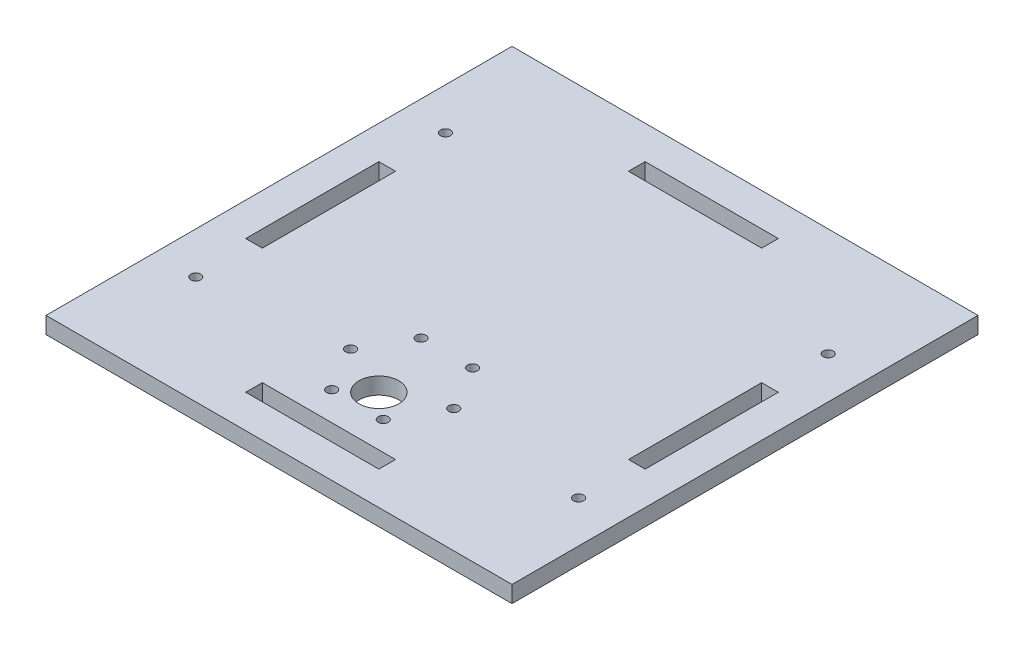
ISO-10303-21;
HEADER;
FILE_DESCRIPTION(('STEP AP214'),'2;1');
FILE_NAME('part.step','',(''),(''),'','','');
FILE_SCHEMA(('AUTOMOTIVE_DESIGN { 1 0 10303 214 1 1 1 1 }'));
ENDSEC;
DATA;
#1=APPLICATION_CONTEXT('core data for automotive mechanical design processes');
#2=APPLICATION_PROTOCOL_DEFINITION('international standard','automotive_design',2000,#1);
#3=PRODUCT_CONTEXT('',#1,'mechanical');
#4=PRODUCT('Part','Part','',(#3));
#5=PRODUCT_RELATED_PRODUCT_CATEGORY('part','',(#4));
#6=PRODUCT_DEFINITION_FORMATION('','',#4);
#7=PRODUCT_DEFINITION_CONTEXT('part definition',#1,'design');
#8=PRODUCT_DEFINITION('design','',#6,#7);
#9=PRODUCT_DEFINITION_SHAPE('','',#8);
#10=(LENGTH_UNIT() NAMED_UNIT(*) SI_UNIT(.MILLI.,.METRE.));
#11=(NAMED_UNIT(*) PLANE_ANGLE_UNIT() SI_UNIT($,.RADIAN.));
#12=(NAMED_UNIT(*) SI_UNIT($,.STERADIAN.) SOLID_ANGLE_UNIT());
#13=UNCERTAINTY_MEASURE_WITH_UNIT(LENGTH_MEASURE(1.E-05),#10,'distance_accuracy_value','');
#14=(GEOMETRIC_REPRESENTATION_CONTEXT(3) GLOBAL_UNCERTAINTY_ASSIGNED_CONTEXT((#13)) GLOBAL_UNIT_ASSIGNED_CONTEXT((#10,
#11,#12)) REPRESENTATION_CONTEXT('',''));
#15=CARTESIAN_POINT('',(0.,0.,0.));
#16=DIRECTION('',(0.,0.,1.));
#17=DIRECTION('',(1.,0.,0.));
#18=AXIS2_PLACEMENT_3D('',#15,#16,#17);
#19=CARTESIAN_POINT('',(0.,5.,0.));
#20=DIRECTION('',(0.,1.,0.));
#21=DIRECTION('',(0.,0.,1.));
#22=AXIS2_PLACEMENT_3D('',#19,#20,#21);
#23=PLANE('',#22);
#24=CARTESIAN_POINT('',(77.75,5.,-23.5766062413412));
#25=DIRECTION('',(0.,1.,0.));
#26=DIRECTION('',(0.,0.,1.));
#27=AXIS2_PLACEMENT_3D('',#24,#25,#26);
#28=CIRCLE('',#27,1.49999999999999);
#29=CARTESIAN_POINT('',(77.75,5.,-22.0766062413412));
#30=VERTEX_POINT('',#29);
#31=EDGE_CURVE('E714',#30,#30,#28,.T.);
#32=ORIENTED_EDGE('',*,*,#31,.F.);
#33=EDGE_LOOP('',(#32));
#34=FACE_BOUND('',#33,.T.);
#35=CARTESIAN_POINT('',(62.2500000000001,5.,-50.4233937586589));
#36=DIRECTION('',(0.,1.,0.));
#37=DIRECTION('',(0.,0.,1.));
#38=AXIS2_PLACEMENT_3D('',#35,#36,#37);
#39=CIRCLE('',#38,1.5);
#40=CARTESIAN_POINT('',(62.2500000000001,5.,-48.9233937586589));
#41=VERTEX_POINT('',#40);
#42=EDGE_CURVE('E722',#41,#41,#39,.T.);
#43=ORIENTED_EDGE('',*,*,#42,.F.);
#44=EDGE_LOOP('',(#43));
#45=FACE_BOUND('',#44,.T.);
#46=CARTESIAN_POINT('',(70.,5.,-30.));
#47=DIRECTION('',(0.,1.,0.));
#48=DIRECTION('',(0.,0.,1.));
#49=AXIS2_PLACEMENT_3D('',#46,#47,#48);
#50=CIRCLE('',#49,6.);
#51=CARTESIAN_POINT('',(70.,5.,-24.));
#52=VERTEX_POINT('',#51);
#53=EDGE_CURVE('E730',#52,#52,#50,.T.);
#54=ORIENTED_EDGE('',*,*,#53,.F.);
#55=EDGE_LOOP('',(#54));
#56=FACE_BOUND('',#55,.T.);
#57=DIRECTION('',(-1.,0.,0.));
#58=VECTOR('',#57,1.);
#59=CARTESIAN_POINT('',(130.,5.,-90.));
#60=LINE('',#59,#58);
#61=CARTESIAN_POINT('',(130.,5.,-90.));
#62=VERTEX_POINT('',#61);
#63=CARTESIAN_POINT('',(125.,5.,-90.));
#64=VERTEX_POINT('',#63);
#65=EDGE_CURVE('E442',#62,#64,#60,.T.);
#66=ORIENTED_EDGE('',*,*,#65,.F.);
#67=DIRECTION('',(0.,0.,-1.));
#68=VECTOR('',#67,1.);
#69=CARTESIAN_POINT('',(130.,5.,-50.));
#70=LINE('',#69,#68);
#71=CARTESIAN_POINT('',(130.,5.,-50.));
#72=VERTEX_POINT('',#71);
#73=EDGE_CURVE('E434',#72,#62,#70,.T.);
#74=ORIENTED_EDGE('',*,*,#73,.F.);
#75=DIRECTION('',(1.,0.,0.));
#76=VECTOR('',#75,1.);
#77=CARTESIAN_POINT('',(125.,5.,-50.));
#78=LINE('',#77,#76);
#79=CARTESIAN_POINT('',(125.,5.,-50.));
#80=VERTEX_POINT('',#79);
#81=EDGE_CURVE('E457',#80,#72,#78,.T.);
#82=ORIENTED_EDGE('',*,*,#81,.F.);
#83=DIRECTION('',(0.,0.,1.));
#84=VECTOR('',#83,1.);
#85=CARTESIAN_POINT('',(125.,5.,-90.));
#86=LINE('',#85,#84);
#87=EDGE_CURVE('E455',#64,#80,#86,.T.);
#88=ORIENTED_EDGE('',*,*,#87,.F.);
#89=EDGE_LOOP('',(#66,#74,#82,#88));
#90=FACE_BOUND('',#89,.T.);
#91=DIRECTION('',(-1.,0.,0.));
#92=VECTOR('',#91,1.);
#93=CARTESIAN_POINT('',(90.,5.,-15.));
#94=LINE('',#93,#92);
#95=CARTESIAN_POINT('',(90.,5.,-15.));
#96=VERTEX_POINT('',#95);
#97=CARTESIAN_POINT('',(50.,5.,-15.));
#98=VERTEX_POINT('',#97);
#99=EDGE_CURVE('E513',#96,#98,#94,.T.);
#100=ORIENTED_EDGE('',*,*,#99,.F.);
#101=DIRECTION('',(0.,0.,-1.));
#102=VECTOR('',#101,1.);
#103=CARTESIAN_POINT('',(90.,5.,-10.));
#104=LINE('',#103,#102);
#105=CARTESIAN_POINT('',(90.,5.,-10.));
#106=VERTEX_POINT('',#105);
#107=EDGE_CURVE('E511',#106,#96,#104,.T.);
#108=ORIENTED_EDGE('',*,*,#107,.F.);
#109=DIRECTION('',(1.,0.,0.));
#110=VECTOR('',#109,1.);
#111=CARTESIAN_POINT('',(50.,5.,-10.));
#112=LINE('',#111,#110);
#113=CARTESIAN_POINT('',(50.,5.,-10.));
#114=VERTEX_POINT('',#113);
#115=EDGE_CURVE('E519',#114,#106,#112,.T.);
#116=ORIENTED_EDGE('',*,*,#115,.F.);
#117=DIRECTION('',(0.,0.,1.));
#118=VECTOR('',#117,1.);
#119=CARTESIAN_POINT('',(50.,5.,-15.));
#120=LINE('',#119,#118);
#121=EDGE_CURVE('E516',#98,#114,#120,.T.);
#122=ORIENTED_EDGE('',*,*,#121,.F.);
#123=EDGE_LOOP('',(#100,#108,#116,#122));
#124=FACE_BOUND('',#123,.T.);
#125=CARTESIAN_POINT('',(127.5,5.,-32.5));
#126=DIRECTION('',(0.,1.,0.));
#127=DIRECTION('',(0.,0.,1.));
#128=AXIS2_PLACEMENT_3D('',#125,#126,#127);
#129=CIRCLE('',#128,1.5);
#130=CARTESIAN_POINT('',(127.5,5.,-31.));
#131=VERTEX_POINT('',#130);
#132=EDGE_CURVE('E580',#131,#131,#129,.T.);
#133=ORIENTED_EDGE('',*,*,#132,.F.);
#134=EDGE_LOOP('',(#133));
#135=FACE_BOUND('',#134,.T.);
#136=DIRECTION('',(0.,0.,1.));
#137=VECTOR('',#136,1.);
#138=CARTESIAN_POINT('',(0.,5.,-140.));
#139=LINE('',#138,#137);
#140=CARTESIAN_POINT('',(0.,5.,-140.));
#141=VERTEX_POINT('',#140);
#142=CARTESIAN_POINT('',(0.,5.,0.));
#143=VERTEX_POINT('',#142);
#144=EDGE_CURVE('E592',#141,#143,#139,.T.);
#145=ORIENTED_EDGE('',*,*,#144,.T.);
#146=DIRECTION('',(1.,0.,0.));
#147=VECTOR('',#146,1.);
#148=CARTESIAN_POINT('',(0.,5.,0.));
#149=LINE('',#148,#147);
#150=CARTESIAN_POINT('',(140.,5.,0.));
#151=VERTEX_POINT('',#150);
#152=EDGE_CURVE('E595',#143,#151,#149,.T.);
#153=ORIENTED_EDGE('',*,*,#152,.T.);
#154=DIRECTION('',(0.,0.,-1.));
#155=VECTOR('',#154,1.);
#156=CARTESIAN_POINT('',(140.,5.,0.));
#157=LINE('',#156,#155);
#158=CARTESIAN_POINT('',(140.,5.,-140.));
#159=VERTEX_POINT('',#158);
#160=EDGE_CURVE('E598',#151,#159,#157,.T.);
#161=ORIENTED_EDGE('',*,*,#160,.T.);
#162=DIRECTION('',(-1.,0.,0.));
#163=VECTOR('',#162,1.);
#164=CARTESIAN_POINT('',(140.,5.,-140.));
#165=LINE('',#164,#163);
#166=EDGE_CURVE('E600',#159,#141,#165,.T.);
#167=ORIENTED_EDGE('',*,*,#166,.T.);
#168=EDGE_LOOP('',(#145,#153,#161,#167));
#169=FACE_BOUND('',#168,.T.);
#170=CARTESIAN_POINT('',(12.5,5.,-107.5));
#171=DIRECTION('',(0.,1.,0.));
#172=DIRECTION('',(0.,0.,1.));
#173=AXIS2_PLACEMENT_3D('',#170,#171,#172);
#174=CIRCLE('',#173,1.5);
#175=CARTESIAN_POINT('',(12.5,5.,-106.));
#176=VERTEX_POINT('',#175);
#177=EDGE_CURVE('E586',#176,#176,#174,.T.);
#178=ORIENTED_EDGE('',*,*,#177,.F.);
#179=EDGE_LOOP('',(#178));
#180=FACE_BOUND('',#179,.T.);
#181=DIRECTION('',(1.,0.,0.));
#182=VECTOR('',#181,1.);
#183=CARTESIAN_POINT('',(10.,5.,-90.));
#184=LINE('',#183,#182);
#185=CARTESIAN_POINT('',(10.,5.,-90.));
#186=VERTEX_POINT('',#185);
#187=CARTESIAN_POINT('',(15.,5.,-90.));
#188=VERTEX_POINT('',#187);
#189=EDGE_CURVE('E548',#186,#188,#184,.T.);
#190=ORIENTED_EDGE('',*,*,#189,.T.);
#191=DIRECTION('',(0.,0.,1.));
#192=VECTOR('',#191,1.);
#193=CARTESIAN_POINT('',(15.,5.,-90.));
#194=LINE('',#193,#192);
#195=CARTESIAN_POINT('',(15.,5.,-50.));
#196=VERTEX_POINT('',#195);
#197=EDGE_CURVE('E551',#188,#196,#194,.T.);
#198=ORIENTED_EDGE('',*,*,#197,.T.);
#199=DIRECTION('',(-1.,0.,0.));
#200=VECTOR('',#199,1.);
#201=CARTESIAN_POINT('',(15.,5.,-50.));
#202=LINE('',#201,#200);
#203=CARTESIAN_POINT('',(10.,5.,-50.));
#204=VERTEX_POINT('',#203);
#205=EDGE_CURVE('E555',#196,#204,#202,.T.);
#206=ORIENTED_EDGE('',*,*,#205,.T.);
#207=DIRECTION('',(0.,0.,-1.));
#208=VECTOR('',#207,1.);
#209=CARTESIAN_POINT('',(10.,5.,-50.));
#210=LINE('',#209,#208);
#211=EDGE_CURVE('E558',#204,#186,#210,.T.);
#212=ORIENTED_EDGE('',*,*,#211,.T.);
#213=EDGE_LOOP('',(#190,#198,#206,#212));
#214=FACE_BOUND('',#213,.T.);
#215=CARTESIAN_POINT('',(12.5,5.,-32.5));
#216=DIRECTION('',(0.,-1.,0.));
#217=DIRECTION('',(0.,0.,-1.));
#218=AXIS2_PLACEMENT_3D('',#215,#216,#217);
#219=CIRCLE('',#218,1.5);
#220=CARTESIAN_POINT('',(12.5,5.,-34.));
#221=VERTEX_POINT('',#220);
#222=EDGE_CURVE('E542',#221,#221,#219,.T.);
#223=ORIENTED_EDGE('',*,*,#222,.T.);
#224=EDGE_LOOP('',(#223));
#225=FACE_BOUND('',#224,.T.);
#226=DIRECTION('',(0.,0.,1.));
#227=VECTOR('',#226,1.);
#228=CARTESIAN_POINT('',(90.,5.,-130.));
#229=LINE('',#228,#227);
#230=CARTESIAN_POINT('',(90.,5.,-130.));
#231=VERTEX_POINT('',#230);
#232=CARTESIAN_POINT('',(90.,5.,-125.));
#233=VERTEX_POINT('',#232);
#234=EDGE_CURVE('E479',#231,#233,#229,.T.);
#235=ORIENTED_EDGE('',*,*,#234,.T.);
#236=DIRECTION('',(-1.,0.,0.));
#237=VECTOR('',#236,1.);
#238=CARTESIAN_POINT('',(90.,5.,-125.));
#239=LINE('',#238,#237);
#240=CARTESIAN_POINT('',(50.,5.,-125.));
#241=VERTEX_POINT('',#240);
#242=EDGE_CURVE('E482',#233,#241,#239,.T.);
#243=ORIENTED_EDGE('',*,*,#242,.T.);
#244=DIRECTION('',(0.,0.,-1.));
#245=VECTOR('',#244,1.);
#246=CARTESIAN_POINT('',(50.,5.,-125.));
#247=LINE('',#246,#245);
#248=CARTESIAN_POINT('',(50.,5.,-130.));
#249=VERTEX_POINT('',#248);
#250=EDGE_CURVE('E486',#241,#249,#247,.T.);
#251=ORIENTED_EDGE('',*,*,#250,.T.);
#252=DIRECTION('',(1.,0.,0.));
#253=VECTOR('',#252,1.);
#254=CARTESIAN_POINT('',(50.,5.,-130.));
#255=LINE('',#254,#253);
#256=EDGE_CURVE('E489',#249,#231,#255,.T.);
#257=ORIENTED_EDGE('',*,*,#256,.T.);
#258=EDGE_LOOP('',(#235,#243,#251,#257));
#259=FACE_BOUND('',#258,.T.);
#260=CARTESIAN_POINT('',(127.5,5.,-107.5));
#261=DIRECTION('',(0.,-1.,0.));
#262=DIRECTION('',(0.,0.,-1.));
#263=AXIS2_PLACEMENT_3D('',#260,#261,#262);
#264=CIRCLE('',#263,1.5);
#265=CARTESIAN_POINT('',(127.5,5.,-109.));
#266=VERTEX_POINT('',#265);
#267=EDGE_CURVE('E473',#266,#266,#264,.T.);
#268=ORIENTED_EDGE('',*,*,#267,.T.);
#269=EDGE_LOOP('',(#268));
#270=FACE_BOUND('',#269,.T.);
#271=CARTESIAN_POINT('',(54.5,5.,-37.0000000000001));
#272=DIRECTION('',(0.,1.,0.));
#273=DIRECTION('',(0.,0.,1.));
#274=AXIS2_PLACEMENT_3D('',#271,#272,#273);
#275=CIRCLE('',#274,1.5);
#276=CARTESIAN_POINT('',(54.5,5.,-35.5000000000001));
#277=VERTEX_POINT('',#276);
#278=EDGE_CURVE('E463',#277,#277,#275,.T.);
#279=ORIENTED_EDGE('',*,*,#278,.F.);
#280=EDGE_LOOP('',(#279));
#281=FACE_BOUND('',#280,.T.);
#282=CARTESIAN_POINT('',(77.7500000000002,5.,-50.4233937586587));
#283=DIRECTION('',(0.,1.,0.));
#284=DIRECTION('',(0.,0.,1.));
#285=AXIS2_PLACEMENT_3D('',#282,#283,#284);
#286=CIRCLE('',#285,1.49999999999999);
#287=CARTESIAN_POINT('',(77.7500000000002,5.,-48.9233937586587));
#288=VERTEX_POINT('',#287);
#289=EDGE_CURVE('E726',#288,#288,#286,.T.);
#290=ORIENTED_EDGE('',*,*,#289,.F.);
#291=EDGE_LOOP('',(#290));
#292=FACE_BOUND('',#291,.T.);
#293=CARTESIAN_POINT('',(85.5,5.,-37.));
#294=DIRECTION('',(0.,1.,0.));
#295=DIRECTION('',(0.,0.,1.));
#296=AXIS2_PLACEMENT_3D('',#293,#294,#295);
#297=CIRCLE('',#296,1.5);
#298=CARTESIAN_POINT('',(85.5,5.,-35.5));
#299=VERTEX_POINT('',#298);
#300=EDGE_CURVE('E718',#299,#299,#297,.T.);
#301=ORIENTED_EDGE('',*,*,#300,.F.);
#302=EDGE_LOOP('',(#301));
#303=FACE_BOUND('',#302,.T.);
#304=CARTESIAN_POINT('',(62.25,5.,-23.5766062413412));
#305=DIRECTION('',(0.,1.,0.));
#306=DIRECTION('',(0.,0.,1.));
#307=AXIS2_PLACEMENT_3D('',#304,#305,#306);
#308=CIRCLE('',#307,1.5);
#309=CARTESIAN_POINT('',(62.25,5.,-22.0766062413412));
#310=VERTEX_POINT('',#309);
#311=EDGE_CURVE('E709',#310,#310,#308,.T.);
#312=ORIENTED_EDGE('',*,*,#311,.F.);
#313=EDGE_LOOP('',(#312));
#314=FACE_BOUND('',#313,.T.);
#315=ADVANCED_FACE('F297',(#34,#45,#56,#90,#124,#135,#169,#180,#214,#225,#259,#270,#281,#292,
#303,#314),#23,.T.);
#316=CARTESIAN_POINT('',(0.,0.,0.));
#317=DIRECTION('',(0.,1.,0.));
#318=DIRECTION('',(0.,0.,1.));
#319=AXIS2_PLACEMENT_3D('',#316,#317,#318);
#320=PLANE('',#319);
#321=DIRECTION('',(0.,0.,-1.));
#322=VECTOR('',#321,1.);
#323=CARTESIAN_POINT('',(90.,0.,-10.));
#324=LINE('',#323,#322);
#325=CARTESIAN_POINT('',(90.,0.,-10.));
#326=VERTEX_POINT('',#325);
#327=CARTESIAN_POINT('',(90.,0.,-15.));
#328=VERTEX_POINT('',#327);
#329=EDGE_CURVE('E504',#326,#328,#324,.T.);
#330=ORIENTED_EDGE('',*,*,#329,.T.);
#331=DIRECTION('',(-1.,0.,0.));
#332=VECTOR('',#331,1.);
#333=CARTESIAN_POINT('',(90.,0.,-15.));
#334=LINE('',#333,#332);
#335=CARTESIAN_POINT('',(50.,0.,-15.));
#336=VERTEX_POINT('',#335);
#337=EDGE_CURVE('E524',#328,#336,#334,.T.);
#338=ORIENTED_EDGE('',*,*,#337,.T.);
#339=DIRECTION('',(0.,0.,1.));
#340=VECTOR('',#339,1.);
#341=CARTESIAN_POINT('',(50.,0.,-15.));
#342=LINE('',#341,#340);
#343=CARTESIAN_POINT('',(50.,0.,-10.));
#344=VERTEX_POINT('',#343);
#345=EDGE_CURVE('E527',#336,#344,#342,.T.);
#346=ORIENTED_EDGE('',*,*,#345,.T.);
#347=DIRECTION('',(1.,0.,0.));
#348=VECTOR('',#347,1.);
#349=CARTESIAN_POINT('',(50.,0.,-10.));
#350=LINE('',#349,#348);
#351=EDGE_CURVE('E514',#344,#326,#350,.T.);
#352=ORIENTED_EDGE('',*,*,#351,.T.);
#353=EDGE_LOOP('',(#330,#338,#346,#352));
#354=FACE_BOUND('',#353,.T.);
#355=CARTESIAN_POINT('',(12.5,0.,-32.5));
#356=DIRECTION('',(0.,-1.,0.));
#357=DIRECTION('',(0.,0.,-1.));
#358=AXIS2_PLACEMENT_3D('',#355,#356,#357);
#359=CIRCLE('',#358,1.5);
#360=CARTESIAN_POINT('',(12.5,0.,-34.));
#361=VERTEX_POINT('',#360);
#362=EDGE_CURVE('E541',#361,#361,#359,.T.);
#363=ORIENTED_EDGE('',*,*,#362,.F.);
#364=EDGE_LOOP('',(#363));
#365=FACE_BOUND('',#364,.T.);
#366=DIRECTION('',(0.,0.,1.));
#367=VECTOR('',#366,1.);
#368=CARTESIAN_POINT('',(15.,0.,-90.));
#369=LINE('',#368,#367);
#370=CARTESIAN_POINT('',(15.,0.,-90.));
#371=VERTEX_POINT('',#370);
#372=CARTESIAN_POINT('',(15.,0.,-50.));
#373=VERTEX_POINT('',#372);
#374=EDGE_CURVE('E563',#371,#373,#369,.T.);
#375=ORIENTED_EDGE('',*,*,#374,.F.);
#376=DIRECTION('',(1.,0.,0.));
#377=VECTOR('',#376,1.);
#378=CARTESIAN_POINT('',(10.,0.,-90.));
#379=LINE('',#378,#377);
#380=CARTESIAN_POINT('',(10.,0.,-90.));
#381=VERTEX_POINT('',#380);
#382=EDGE_CURVE('E545',#381,#371,#379,.T.);
#383=ORIENTED_EDGE('',*,*,#382,.F.);
#384=DIRECTION('',(0.,0.,-1.));
#385=VECTOR('',#384,1.);
#386=CARTESIAN_POINT('',(10.,0.,-50.));
#387=LINE('',#386,#385);
#388=CARTESIAN_POINT('',(10.,0.,-50.));
#389=VERTEX_POINT('',#388);
#390=EDGE_CURVE('E552',#389,#381,#387,.T.);
#391=ORIENTED_EDGE('',*,*,#390,.F.);
#392=DIRECTION('',(-1.,0.,0.));
#393=VECTOR('',#392,1.);
#394=CARTESIAN_POINT('',(15.,0.,-50.));
#395=LINE('',#394,#393);
#396=EDGE_CURVE('E566',#373,#389,#395,.T.);
#397=ORIENTED_EDGE('',*,*,#396,.F.);
#398=EDGE_LOOP('',(#375,#383,#391,#397));
#399=FACE_BOUND('',#398,.T.);
#400=DIRECTION('',(0.,0.,1.));
#401=VECTOR('',#400,1.);
#402=CARTESIAN_POINT('',(0.,0.,-140.));
#403=LINE('',#402,#401);
#404=CARTESIAN_POINT('',(0.,0.,-140.));
#405=VERTEX_POINT('',#404);
#406=CARTESIAN_POINT('',(0.,0.,0.));
#407=VERTEX_POINT('',#406);
#408=EDGE_CURVE('E589',#405,#407,#403,.T.);
#409=ORIENTED_EDGE('',*,*,#408,.F.);
#410=DIRECTION('',(-1.,0.,0.));
#411=VECTOR('',#410,1.);
#412=CARTESIAN_POINT('',(140.,0.,-140.));
#413=LINE('',#412,#411);
#414=CARTESIAN_POINT('',(140.,0.,-140.));
#415=VERTEX_POINT('',#414);
#416=EDGE_CURVE('E596',#415,#405,#413,.T.);
#417=ORIENTED_EDGE('',*,*,#416,.F.);
#418=DIRECTION('',(0.,0.,-1.));
#419=VECTOR('',#418,1.);
#420=CARTESIAN_POINT('',(140.,0.,0.));
#421=LINE('',#420,#419);
#422=CARTESIAN_POINT('',(140.,0.,0.));
#423=VERTEX_POINT('',#422);
#424=EDGE_CURVE('E607',#423,#415,#421,.T.);
#425=ORIENTED_EDGE('',*,*,#424,.F.);
#426=DIRECTION('',(1.,0.,0.));
#427=VECTOR('',#426,1.);
#428=CARTESIAN_POINT('',(0.,0.,0.));
#429=LINE('',#428,#427);
#430=EDGE_CURVE('E605',#407,#423,#429,.T.);
#431=ORIENTED_EDGE('',*,*,#430,.F.);
#432=EDGE_LOOP('',(#409,#417,#425,#431));
#433=FACE_BOUND('',#432,.T.);
#434=CARTESIAN_POINT('',(12.5,0.,-107.5));
#435=DIRECTION('',(0.,1.,0.));
#436=DIRECTION('',(0.,0.,1.));
#437=AXIS2_PLACEMENT_3D('',#434,#435,#436);
#438=CIRCLE('',#437,1.5);
#439=CARTESIAN_POINT('',(12.5,0.,-106.));
#440=VERTEX_POINT('',#439);
#441=EDGE_CURVE('E583',#440,#440,#438,.T.);
#442=ORIENTED_EDGE('',*,*,#441,.T.);
#443=EDGE_LOOP('',(#442));
#444=FACE_BOUND('',#443,.T.);
#445=CARTESIAN_POINT('',(127.5,0.,-32.5));
#446=DIRECTION('',(0.,1.,0.));
#447=DIRECTION('',(0.,0.,1.));
#448=AXIS2_PLACEMENT_3D('',#445,#446,#447);
#449=CIRCLE('',#448,1.5);
#450=CARTESIAN_POINT('',(127.5,0.,-31.));
#451=VERTEX_POINT('',#450);
#452=EDGE_CURVE('E573',#451,#451,#449,.T.);
#453=ORIENTED_EDGE('',*,*,#452,.T.);
#454=EDGE_LOOP('',(#453));
#455=FACE_BOUND('',#454,.T.);
#456=DIRECTION('',(-1.,0.,0.));
#457=VECTOR('',#456,1.);
#458=CARTESIAN_POINT('',(90.,0.,-125.));
#459=LINE('',#458,#457);
#460=CARTESIAN_POINT('',(90.,0.,-125.));
#461=VERTEX_POINT('',#460);
#462=CARTESIAN_POINT('',(50.,0.,-125.));
#463=VERTEX_POINT('',#462);
#464=EDGE_CURVE('E494',#461,#463,#459,.T.);
#465=ORIENTED_EDGE('',*,*,#464,.F.);
#466=DIRECTION('',(0.,0.,1.));
#467=VECTOR('',#466,1.);
#468=CARTESIAN_POINT('',(90.,0.,-130.));
#469=LINE('',#468,#467);
#470=CARTESIAN_POINT('',(90.,0.,-130.));
#471=VERTEX_POINT('',#470);
#472=EDGE_CURVE('E476',#471,#461,#469,.T.);
#473=ORIENTED_EDGE('',*,*,#472,.F.);
#474=DIRECTION('',(1.,0.,0.));
#475=VECTOR('',#474,1.);
#476=CARTESIAN_POINT('',(50.,0.,-130.));
#477=LINE('',#476,#475);
#478=CARTESIAN_POINT('',(50.,0.,-130.));
#479=VERTEX_POINT('',#478);
#480=EDGE_CURVE('E483',#479,#471,#477,.T.);
#481=ORIENTED_EDGE('',*,*,#480,.F.);
#482=DIRECTION('',(0.,0.,-1.));
#483=VECTOR('',#482,1.);
#484=CARTESIAN_POINT('',(50.,0.,-125.));
#485=LINE('',#484,#483);
#486=EDGE_CURVE('E497',#463,#479,#485,.T.);
#487=ORIENTED_EDGE('',*,*,#486,.F.);
#488=EDGE_LOOP('',(#465,#473,#481,#487));
#489=FACE_BOUND('',#488,.T.);
#490=CARTESIAN_POINT('',(127.5,0.,-107.5));
#491=DIRECTION('',(0.,-1.,0.));
#492=DIRECTION('',(0.,0.,-1.));
#493=AXIS2_PLACEMENT_3D('',#490,#491,#492);
#494=CIRCLE('',#493,1.5);
#495=CARTESIAN_POINT('',(127.5,0.,-109.));
#496=VERTEX_POINT('',#495);
#497=EDGE_CURVE('E450',#496,#496,#494,.T.);
#498=ORIENTED_EDGE('',*,*,#497,.F.);
#499=EDGE_LOOP('',(#498));
#500=FACE_BOUND('',#499,.T.);
#501=DIRECTION('',(0.,0.,-1.));
#502=VECTOR('',#501,1.);
#503=CARTESIAN_POINT('',(130.,0.,-50.));
#504=LINE('',#503,#502);
#505=CARTESIAN_POINT('',(130.,0.,-50.));
#506=VERTEX_POINT('',#505);
#507=CARTESIAN_POINT('',(130.,0.,-90.));
#508=VERTEX_POINT('',#507);
#509=EDGE_CURVE('E320',#506,#508,#504,.T.);
#510=ORIENTED_EDGE('',*,*,#509,.T.);
#511=DIRECTION('',(-1.,0.,0.));
#512=VECTOR('',#511,1.);
#513=CARTESIAN_POINT('',(130.,0.,-90.));
#514=LINE('',#513,#512);
#515=CARTESIAN_POINT('',(125.,0.,-90.));
#516=VERTEX_POINT('',#515);
#517=EDGE_CURVE('E449',#508,#516,#514,.T.);
#518=ORIENTED_EDGE('',*,*,#517,.T.);
#519=DIRECTION('',(0.,0.,1.));
#520=VECTOR('',#519,1.);
#521=CARTESIAN_POINT('',(125.,0.,-90.));
#522=LINE('',#521,#520);
#523=CARTESIAN_POINT('',(125.,0.,-50.));
#524=VERTEX_POINT('',#523);
#525=EDGE_CURVE('E465',#516,#524,#522,.T.);
#526=ORIENTED_EDGE('',*,*,#525,.T.);
#527=DIRECTION('',(1.,0.,0.));
#528=VECTOR('',#527,1.);
#529=CARTESIAN_POINT('',(125.,0.,-50.));
#530=LINE('',#529,#528);
#531=EDGE_CURVE('E443',#524,#506,#530,.T.);
#532=ORIENTED_EDGE('',*,*,#531,.T.);
#533=EDGE_LOOP('',(#510,#518,#526,#532));
#534=FACE_BOUND('',#533,.T.);
#535=CARTESIAN_POINT('',(54.5,0.,-37.0000000000001));
#536=DIRECTION('',(0.,1.,0.));
#537=DIRECTION('',(0.,0.,1.));
#538=AXIS2_PLACEMENT_3D('',#535,#536,#537);
#539=CIRCLE('',#538,1.5);
#540=CARTESIAN_POINT('',(54.5,0.,-35.5000000000001));
#541=VERTEX_POINT('',#540);
#542=EDGE_CURVE('E684',#541,#541,#539,.T.);
#543=ORIENTED_EDGE('',*,*,#542,.T.);
#544=EDGE_LOOP('',(#543));
#545=FACE_BOUND('',#544,.T.);
#546=CARTESIAN_POINT('',(70.,0.,-30.));
#547=DIRECTION('',(0.,1.,0.));
#548=DIRECTION('',(0.,0.,1.));
#549=AXIS2_PLACEMENT_3D('',#546,#547,#548);
#550=CIRCLE('',#549,6.);
#551=CARTESIAN_POINT('',(70.,0.,-24.));
#552=VERTEX_POINT('',#551);
#553=EDGE_CURVE('E688',#552,#552,#550,.T.);
#554=ORIENTED_EDGE('',*,*,#553,.T.);
#555=EDGE_LOOP('',(#554));
#556=FACE_BOUND('',#555,.T.);
#557=CARTESIAN_POINT('',(77.7500000000002,0.,-50.4233937586587));
#558=DIRECTION('',(0.,1.,0.));
#559=DIRECTION('',(0.,0.,1.));
#560=AXIS2_PLACEMENT_3D('',#557,#558,#559);
#561=CIRCLE('',#560,1.49999999999999);
#562=CARTESIAN_POINT('',(77.7500000000002,0.,-48.9233937586587));
#563=VERTEX_POINT('',#562);
#564=EDGE_CURVE('E692',#563,#563,#561,.T.);
#565=ORIENTED_EDGE('',*,*,#564,.T.);
#566=EDGE_LOOP('',(#565));
#567=FACE_BOUND('',#566,.T.);
#568=CARTESIAN_POINT('',(62.2500000000001,0.,-50.4233937586589));
#569=DIRECTION('',(0.,1.,0.));
#570=DIRECTION('',(0.,0.,1.));
#571=AXIS2_PLACEMENT_3D('',#568,#569,#570);
#572=CIRCLE('',#571,1.5);
#573=CARTESIAN_POINT('',(62.2500000000001,0.,-48.9233937586589));
#574=VERTEX_POINT('',#573);
#575=EDGE_CURVE('E696',#574,#574,#572,.T.);
#576=ORIENTED_EDGE('',*,*,#575,.T.);
#577=EDGE_LOOP('',(#576));
#578=FACE_BOUND('',#577,.T.);
#579=CARTESIAN_POINT('',(85.5,0.,-37.));
#580=DIRECTION('',(0.,1.,0.));
#581=DIRECTION('',(0.,0.,1.));
#582=AXIS2_PLACEMENT_3D('',#579,#580,#581);
#583=CIRCLE('',#582,1.5);
#584=CARTESIAN_POINT('',(85.5,0.,-35.5));
#585=VERTEX_POINT('',#584);
#586=EDGE_CURVE('E700',#585,#585,#583,.T.);
#587=ORIENTED_EDGE('',*,*,#586,.T.);
#588=EDGE_LOOP('',(#587));
#589=FACE_BOUND('',#588,.T.);
#590=CARTESIAN_POINT('',(77.75,0.,-23.5766062413412));
#591=DIRECTION('',(0.,1.,0.));
#592=DIRECTION('',(0.,0.,1.));
#593=AXIS2_PLACEMENT_3D('',#590,#591,#592);
#594=CIRCLE('',#593,1.49999999999999);
#595=CARTESIAN_POINT('',(77.75,0.,-22.0766062413412));
#596=VERTEX_POINT('',#595);
#597=EDGE_CURVE('E704',#596,#596,#594,.T.);
#598=ORIENTED_EDGE('',*,*,#597,.T.);
#599=EDGE_LOOP('',(#598));
#600=FACE_BOUND('',#599,.T.);
#601=CARTESIAN_POINT('',(62.25,0.,-23.5766062413412));
#602=DIRECTION('',(0.,1.,0.));
#603=DIRECTION('',(0.,0.,1.));
#604=AXIS2_PLACEMENT_3D('',#601,#602,#603);
#605=CIRCLE('',#604,1.5);
#606=CARTESIAN_POINT('',(62.25,0.,-22.0766062413412));
#607=VERTEX_POINT('',#606);
#608=EDGE_CURVE('E707',#607,#607,#605,.T.);
#609=ORIENTED_EDGE('',*,*,#608,.T.);
#610=EDGE_LOOP('',(#609));
#611=FACE_BOUND('',#610,.T.);
#612=ADVANCED_FACE('F625',(#354,#365,#399,#433,#444,#455,#489,#500,#534,#545,#556,#567,#578,
#589,#600,#611),#320,.F.);
#613=CARTESIAN_POINT('',(0.,5.,-140.));
#614=DIRECTION('',(1.,0.,0.));
#615=DIRECTION('',(0.,0.,-1.));
#616=AXIS2_PLACEMENT_3D('',#613,#614,#615);
#617=PLANE('',#616);
#618=ORIENTED_EDGE('',*,*,#408,.T.);
#619=DIRECTION('',(0.,-1.,0.));
#620=VECTOR('',#619,1.);
#621=CARTESIAN_POINT('',(0.,5.,0.));
#622=LINE('',#621,#620);
#623=EDGE_CURVE('E12',#143,#407,#622,.T.);
#624=ORIENTED_EDGE('',*,*,#623,.F.);
#625=ORIENTED_EDGE('',*,*,#144,.F.);
#626=DIRECTION('',(0.,-1.,0.));
#627=VECTOR('',#626,1.);
#628=CARTESIAN_POINT('',(0.,5.,-140.));
#629=LINE('',#628,#627);
#630=EDGE_CURVE('E602',#141,#405,#629,.T.);
#631=ORIENTED_EDGE('',*,*,#630,.T.);
#632=EDGE_LOOP('',(#618,#624,#625,#631));
#633=FACE_BOUND('',#632,.T.);
#634=ADVANCED_FACE('F299',(#633),#617,.F.);
#635=CARTESIAN_POINT('',(0.,5.,0.));
#636=DIRECTION('',(0.,0.,-1.));
#637=DIRECTION('',(-1.,0.,0.));
#638=AXIS2_PLACEMENT_3D('',#635,#636,#637);
#639=PLANE('',#638);
#640=ORIENTED_EDGE('',*,*,#430,.T.);
#641=DIRECTION('',(0.,-1.,0.));
#642=VECTOR('',#641,1.);
#643=CARTESIAN_POINT('',(140.,5.,0.));
#644=LINE('',#643,#642);
#645=EDGE_CURVE('E305',#151,#423,#644,.T.);
#646=ORIENTED_EDGE('',*,*,#645,.F.);
#647=ORIENTED_EDGE('',*,*,#152,.F.);
#648=ORIENTED_EDGE('',*,*,#623,.T.);
#649=EDGE_LOOP('',(#640,#646,#647,#648));
#650=FACE_BOUND('',#649,.T.);
#651=ADVANCED_FACE('F636',(#650),#639,.F.);
#652=CARTESIAN_POINT('',(140.,5.,0.));
#653=DIRECTION('',(-1.,0.,0.));
#654=DIRECTION('',(0.,0.,1.));
#655=AXIS2_PLACEMENT_3D('',#652,#653,#654);
#656=PLANE('',#655);
#657=ORIENTED_EDGE('',*,*,#424,.T.);
#658=DIRECTION('',(0.,-1.,0.));
#659=VECTOR('',#658,1.);
#660=CARTESIAN_POINT('',(140.,5.,-140.));
#661=LINE('',#660,#659);
#662=EDGE_CURVE('E612',#159,#415,#661,.T.);
#663=ORIENTED_EDGE('',*,*,#662,.F.);
#664=ORIENTED_EDGE('',*,*,#160,.F.);
#665=ORIENTED_EDGE('',*,*,#645,.T.);
#666=EDGE_LOOP('',(#657,#663,#664,#665));
#667=FACE_BOUND('',#666,.T.);
#668=ADVANCED_FACE('F619',(#667),#656,.F.);
#669=CARTESIAN_POINT('',(140.,5.,-140.));
#670=DIRECTION('',(0.,0.,1.));
#671=DIRECTION('',(1.,0.,0.));
#672=AXIS2_PLACEMENT_3D('',#669,#670,#671);
#673=PLANE('',#672);
#674=ORIENTED_EDGE('',*,*,#416,.T.);
#675=ORIENTED_EDGE('',*,*,#630,.F.);
#676=ORIENTED_EDGE('',*,*,#166,.F.);
#677=ORIENTED_EDGE('',*,*,#662,.T.);
#678=EDGE_LOOP('',(#674,#675,#676,#677));
#679=FACE_BOUND('',#678,.T.);
#680=ADVANCED_FACE('F629',(#679),#673,.F.);
#681=CARTESIAN_POINT('',(12.5,5.,-107.5));
#682=DIRECTION('',(0.,-1.,0.));
#683=DIRECTION('',(0.,0.,-1.));
#684=AXIS2_PLACEMENT_3D('',#681,#682,#683);
#685=CYLINDRICAL_SURFACE('',#684,1.5);
#686=ORIENTED_EDGE('',*,*,#177,.T.);
#687=EDGE_LOOP('',(#686));
#688=FACE_BOUND('',#687,.T.);
#689=ORIENTED_EDGE('',*,*,#441,.F.);
#690=EDGE_LOOP('',(#689));
#691=FACE_BOUND('',#690,.T.);
#692=ADVANCED_FACE('F654',(#688,#691),#685,.F.);
#693=CARTESIAN_POINT('',(127.5,5.,-32.5));
#694=DIRECTION('',(0.,-1.,0.));
#695=DIRECTION('',(0.,0.,-1.));
#696=AXIS2_PLACEMENT_3D('',#693,#694,#695);
#697=CYLINDRICAL_SURFACE('',#696,1.5);
#698=ORIENTED_EDGE('',*,*,#132,.T.);
#699=EDGE_LOOP('',(#698));
#700=FACE_BOUND('',#699,.T.);
#701=ORIENTED_EDGE('',*,*,#452,.F.);
#702=EDGE_LOOP('',(#701));
#703=FACE_BOUND('',#702,.T.);
#704=ADVANCED_FACE('F661',(#700,#703),#697,.F.);
#705=CARTESIAN_POINT('',(10.,5.,-90.));
#706=DIRECTION('',(0.,0.,-1.));
#707=DIRECTION('',(-1.,0.,0.));
#708=AXIS2_PLACEMENT_3D('',#705,#706,#707);
#709=PLANE('',#708);
#710=ORIENTED_EDGE('',*,*,#382,.T.);
#711=DIRECTION('',(0.,-1.,0.));
#712=VECTOR('',#711,1.);
#713=CARTESIAN_POINT('',(15.,5.,-90.));
#714=LINE('',#713,#712);
#715=EDGE_CURVE('E561',#188,#371,#714,.T.);
#716=ORIENTED_EDGE('',*,*,#715,.F.);
#717=ORIENTED_EDGE('',*,*,#189,.F.);
#718=DIRECTION('',(0.,-1.,0.));
#719=VECTOR('',#718,1.);
#720=CARTESIAN_POINT('',(10.,5.,-90.));
#721=LINE('',#720,#719);
#722=EDGE_CURVE('E571',#186,#381,#721,.T.);
#723=ORIENTED_EDGE('',*,*,#722,.T.);
#724=EDGE_LOOP('',(#710,#716,#717,#723));
#725=FACE_BOUND('',#724,.T.);
#726=ADVANCED_FACE('F666',(#725),#709,.F.);
#727=CARTESIAN_POINT('',(10.,5.,-50.));
#728=DIRECTION('',(-1.,0.,0.));
#729=DIRECTION('',(0.,0.,1.));
#730=AXIS2_PLACEMENT_3D('',#727,#728,#729);
#731=PLANE('',#730);
#732=ORIENTED_EDGE('',*,*,#390,.T.);
#733=ORIENTED_EDGE('',*,*,#722,.F.);
#734=ORIENTED_EDGE('',*,*,#211,.F.);
#735=DIRECTION('',(0.,-1.,0.));
#736=VECTOR('',#735,1.);
#737=CARTESIAN_POINT('',(10.,5.,-50.));
#738=LINE('',#737,#736);
#739=EDGE_CURVE('E574',#204,#389,#738,.T.);
#740=ORIENTED_EDGE('',*,*,#739,.T.);
#741=EDGE_LOOP('',(#732,#733,#734,#740));
#742=FACE_BOUND('',#741,.T.);
#743=ADVANCED_FACE('F827',(#742),#731,.F.);
#744=CARTESIAN_POINT('',(15.,5.,-50.));
#745=DIRECTION('',(0.,0.,1.));
#746=DIRECTION('',(1.,0.,0.));
#747=AXIS2_PLACEMENT_3D('',#744,#745,#746);
#748=PLANE('',#747);
#749=ORIENTED_EDGE('',*,*,#396,.T.);
#750=ORIENTED_EDGE('',*,*,#739,.F.);
#751=ORIENTED_EDGE('',*,*,#205,.F.);
#752=DIRECTION('',(0.,-1.,0.));
#753=VECTOR('',#752,1.);
#754=CARTESIAN_POINT('',(15.,5.,-50.));
#755=LINE('',#754,#753);
#756=EDGE_CURVE('E576',#196,#373,#755,.T.);
#757=ORIENTED_EDGE('',*,*,#756,.T.);
#758=EDGE_LOOP('',(#749,#750,#751,#757));
#759=FACE_BOUND('',#758,.T.);
#760=ADVANCED_FACE('F830',(#759),#748,.F.);
#761=CARTESIAN_POINT('',(15.,5.,-90.));
#762=DIRECTION('',(1.,0.,0.));
#763=DIRECTION('',(0.,0.,-1.));
#764=AXIS2_PLACEMENT_3D('',#761,#762,#763);
#765=PLANE('',#764);
#766=ORIENTED_EDGE('',*,*,#374,.T.);
#767=ORIENTED_EDGE('',*,*,#756,.F.);
#768=ORIENTED_EDGE('',*,*,#197,.F.);
#769=ORIENTED_EDGE('',*,*,#715,.T.);
#770=EDGE_LOOP('',(#766,#767,#768,#769));
#771=FACE_BOUND('',#770,.T.);
#772=ADVANCED_FACE('F825',(#771),#765,.F.);
#773=CARTESIAN_POINT('',(12.5,5.,-32.5));
#774=DIRECTION('',(0.,-1.,0.));
#775=DIRECTION('',(0.,0.,-1.));
#776=AXIS2_PLACEMENT_3D('',#773,#774,#775);
#777=CYLINDRICAL_SURFACE('',#776,1.5);
#778=ORIENTED_EDGE('',*,*,#222,.F.);
#779=EDGE_LOOP('',(#778));
#780=FACE_BOUND('',#779,.T.);
#781=ORIENTED_EDGE('',*,*,#362,.T.);
#782=EDGE_LOOP('',(#781));
#783=FACE_BOUND('',#782,.T.);
#784=ADVANCED_FACE('F821',(#780,#783),#777,.F.);
#785=CARTESIAN_POINT('',(90.,5.,-10.));
#786=DIRECTION('',(-1.,0.,0.));
#787=DIRECTION('',(0.,0.,1.));
#788=AXIS2_PLACEMENT_3D('',#785,#786,#787);
#789=PLANE('',#788);
#790=ORIENTED_EDGE('',*,*,#329,.F.);
#791=DIRECTION('',(0.,-1.,0.));
#792=VECTOR('',#791,1.);
#793=CARTESIAN_POINT('',(90.,5.,-10.));
#794=LINE('',#793,#792);
#795=EDGE_CURVE('E521',#106,#326,#794,.T.);
#796=ORIENTED_EDGE('',*,*,#795,.F.);
#797=ORIENTED_EDGE('',*,*,#107,.T.);
#798=DIRECTION('',(0.,-1.,0.));
#799=VECTOR('',#798,1.);
#800=CARTESIAN_POINT('',(90.,5.,-15.));
#801=LINE('',#800,#799);
#802=EDGE_CURVE('E538',#96,#328,#801,.T.);
#803=ORIENTED_EDGE('',*,*,#802,.T.);
#804=EDGE_LOOP('',(#790,#796,#797,#803));
#805=FACE_BOUND('',#804,.T.);
#806=ADVANCED_FACE('F817',(#805),#789,.T.);
#807=CARTESIAN_POINT('',(90.,5.,-15.));
#808=DIRECTION('',(0.,0.,1.));
#809=DIRECTION('',(1.,0.,0.));
#810=AXIS2_PLACEMENT_3D('',#807,#808,#809);
#811=PLANE('',#810);
#812=ORIENTED_EDGE('',*,*,#337,.F.);
#813=ORIENTED_EDGE('',*,*,#802,.F.);
#814=ORIENTED_EDGE('',*,*,#99,.T.);
#815=DIRECTION('',(0.,-1.,0.));
#816=VECTOR('',#815,1.);
#817=CARTESIAN_POINT('',(50.,5.,-15.));
#818=LINE('',#817,#816);
#819=EDGE_CURVE('E536',#98,#336,#818,.T.);
#820=ORIENTED_EDGE('',*,*,#819,.T.);
#821=EDGE_LOOP('',(#812,#813,#814,#820));
#822=FACE_BOUND('',#821,.T.);
#823=ADVANCED_FACE('F813',(#822),#811,.T.);
#824=CARTESIAN_POINT('',(50.,5.,-15.));
#825=DIRECTION('',(1.,0.,0.));
#826=DIRECTION('',(0.,0.,-1.));
#827=AXIS2_PLACEMENT_3D('',#824,#825,#826);
#828=PLANE('',#827);
#829=ORIENTED_EDGE('',*,*,#345,.F.);
#830=ORIENTED_EDGE('',*,*,#819,.F.);
#831=ORIENTED_EDGE('',*,*,#121,.T.);
#832=DIRECTION('',(0.,-1.,0.));
#833=VECTOR('',#832,1.);
#834=CARTESIAN_POINT('',(50.,5.,-10.));
#835=LINE('',#834,#833);
#836=EDGE_CURVE('E534',#114,#344,#835,.T.);
#837=ORIENTED_EDGE('',*,*,#836,.T.);
#838=EDGE_LOOP('',(#829,#830,#831,#837));
#839=FACE_BOUND('',#838,.T.);
#840=ADVANCED_FACE('F809',(#839),#828,.T.);
#841=CARTESIAN_POINT('',(50.,5.,-10.));
#842=DIRECTION('',(0.,0.,-1.));
#843=DIRECTION('',(-1.,0.,0.));
#844=AXIS2_PLACEMENT_3D('',#841,#842,#843);
#845=PLANE('',#844);
#846=ORIENTED_EDGE('',*,*,#351,.F.);
#847=ORIENTED_EDGE('',*,*,#836,.F.);
#848=ORIENTED_EDGE('',*,*,#115,.T.);
#849=ORIENTED_EDGE('',*,*,#795,.T.);
#850=EDGE_LOOP('',(#846,#847,#848,#849));
#851=FACE_BOUND('',#850,.T.);
#852=ADVANCED_FACE('F805',(#851),#845,.T.);
#853=CARTESIAN_POINT('',(90.,5.,-130.));
#854=DIRECTION('',(1.,0.,0.));
#855=DIRECTION('',(0.,0.,-1.));
#856=AXIS2_PLACEMENT_3D('',#853,#854,#855);
#857=PLANE('',#856);
#858=ORIENTED_EDGE('',*,*,#472,.T.);
#859=DIRECTION('',(0.,-1.,0.));
#860=VECTOR('',#859,1.);
#861=CARTESIAN_POINT('',(90.,5.,-125.));
#862=LINE('',#861,#860);
#863=EDGE_CURVE('E492',#233,#461,#862,.T.);
#864=ORIENTED_EDGE('',*,*,#863,.F.);
#865=ORIENTED_EDGE('',*,*,#234,.F.);
#866=DIRECTION('',(0.,-1.,0.));
#867=VECTOR('',#866,1.);
#868=CARTESIAN_POINT('',(90.,5.,-130.));
#869=LINE('',#868,#867);
#870=EDGE_CURVE('E502',#231,#471,#869,.T.);
#871=ORIENTED_EDGE('',*,*,#870,.T.);
#872=EDGE_LOOP('',(#858,#864,#865,#871));
#873=FACE_BOUND('',#872,.T.);
#874=ADVANCED_FACE('F795',(#873),#857,.F.);
#875=CARTESIAN_POINT('',(50.,5.,-130.));
#876=DIRECTION('',(0.,0.,-1.));
#877=DIRECTION('',(-1.,0.,0.));
#878=AXIS2_PLACEMENT_3D('',#875,#876,#877);
#879=PLANE('',#878);
#880=ORIENTED_EDGE('',*,*,#480,.T.);
#881=ORIENTED_EDGE('',*,*,#870,.F.);
#882=ORIENTED_EDGE('',*,*,#256,.F.);
#883=DIRECTION('',(0.,-1.,0.));
#884=VECTOR('',#883,1.);
#885=CARTESIAN_POINT('',(50.,5.,-130.));
#886=LINE('',#885,#884);
#887=EDGE_CURVE('E505',#249,#479,#886,.T.);
#888=ORIENTED_EDGE('',*,*,#887,.T.);
#889=EDGE_LOOP('',(#880,#881,#882,#888));
#890=FACE_BOUND('',#889,.T.);
#891=ADVANCED_FACE('F791',(#890),#879,.F.);
#892=CARTESIAN_POINT('',(50.,5.,-125.));
#893=DIRECTION('',(-1.,0.,0.));
#894=DIRECTION('',(0.,0.,1.));
#895=AXIS2_PLACEMENT_3D('',#892,#893,#894);
#896=PLANE('',#895);
#897=ORIENTED_EDGE('',*,*,#486,.T.);
#898=ORIENTED_EDGE('',*,*,#887,.F.);
#899=ORIENTED_EDGE('',*,*,#250,.F.);
#900=DIRECTION('',(0.,-1.,0.));
#901=VECTOR('',#900,1.);
#902=CARTESIAN_POINT('',(50.,5.,-125.));
#903=LINE('',#902,#901);
#904=EDGE_CURVE('E507',#241,#463,#903,.T.);
#905=ORIENTED_EDGE('',*,*,#904,.T.);
#906=EDGE_LOOP('',(#897,#898,#899,#905));
#907=FACE_BOUND('',#906,.T.);
#908=ADVANCED_FACE('F794',(#907),#896,.F.);
#909=CARTESIAN_POINT('',(90.,5.,-125.));
#910=DIRECTION('',(0.,0.,1.));
#911=DIRECTION('',(1.,0.,0.));
#912=AXIS2_PLACEMENT_3D('',#909,#910,#911);
#913=PLANE('',#912);
#914=ORIENTED_EDGE('',*,*,#464,.T.);
#915=ORIENTED_EDGE('',*,*,#904,.F.);
#916=ORIENTED_EDGE('',*,*,#242,.F.);
#917=ORIENTED_EDGE('',*,*,#863,.T.);
#918=EDGE_LOOP('',(#914,#915,#916,#917));
#919=FACE_BOUND('',#918,.T.);
#920=ADVANCED_FACE('F789',(#919),#913,.F.);
#921=CARTESIAN_POINT('',(127.5,5.,-107.5));
#922=DIRECTION('',(0.,-1.,0.));
#923=DIRECTION('',(0.,0.,-1.));
#924=AXIS2_PLACEMENT_3D('',#921,#922,#923);
#925=CYLINDRICAL_SURFACE('',#924,1.5);
#926=ORIENTED_EDGE('',*,*,#267,.F.);
#927=EDGE_LOOP('',(#926));
#928=FACE_BOUND('',#927,.T.);
#929=ORIENTED_EDGE('',*,*,#497,.T.);
#930=EDGE_LOOP('',(#929));
#931=FACE_BOUND('',#930,.T.);
#932=ADVANCED_FACE('F786',(#928,#931),#925,.F.);
#933=CARTESIAN_POINT('',(130.,5.,-50.));
#934=DIRECTION('',(-1.,0.,0.));
#935=DIRECTION('',(0.,0.,1.));
#936=AXIS2_PLACEMENT_3D('',#933,#934,#935);
#937=PLANE('',#936);
#938=ORIENTED_EDGE('',*,*,#509,.F.);
#939=DIRECTION('',(0.,-1.,0.));
#940=VECTOR('',#939,1.);
#941=CARTESIAN_POINT('',(130.,5.,-50.));
#942=LINE('',#941,#940);
#943=EDGE_CURVE('E438',#72,#506,#942,.T.);
#944=ORIENTED_EDGE('',*,*,#943,.F.);
#945=ORIENTED_EDGE('',*,*,#73,.T.);
#946=DIRECTION('',(0.,-1.,0.));
#947=VECTOR('',#946,1.);
#948=CARTESIAN_POINT('',(130.,5.,-90.));
#949=LINE('',#948,#947);
#950=EDGE_CURVE('E437',#62,#508,#949,.T.);
#951=ORIENTED_EDGE('',*,*,#950,.T.);
#952=EDGE_LOOP('',(#938,#944,#945,#951));
#953=FACE_BOUND('',#952,.T.);
#954=ADVANCED_FACE('F436',(#953),#937,.T.);
#955=CARTESIAN_POINT('',(130.,5.,-90.));
#956=DIRECTION('',(0.,0.,1.));
#957=DIRECTION('',(1.,0.,0.));
#958=AXIS2_PLACEMENT_3D('',#955,#956,#957);
#959=PLANE('',#958);
#960=ORIENTED_EDGE('',*,*,#517,.F.);
#961=ORIENTED_EDGE('',*,*,#950,.F.);
#962=ORIENTED_EDGE('',*,*,#65,.T.);
#963=DIRECTION('',(0.,-1.,0.));
#964=VECTOR('',#963,1.);
#965=CARTESIAN_POINT('',(125.,5.,-90.));
#966=LINE('',#965,#964);
#967=EDGE_CURVE('E451',#64,#516,#966,.T.);
#968=ORIENTED_EDGE('',*,*,#967,.T.);
#969=EDGE_LOOP('',(#960,#961,#962,#968));
#970=FACE_BOUND('',#969,.T.);
#971=ADVANCED_FACE('F446',(#970),#959,.T.);
#972=CARTESIAN_POINT('',(125.,5.,-90.));
#973=DIRECTION('',(1.,0.,0.));
#974=DIRECTION('',(0.,0.,-1.));
#975=AXIS2_PLACEMENT_3D('',#972,#973,#974);
#976=PLANE('',#975);
#977=ORIENTED_EDGE('',*,*,#525,.F.);
#978=ORIENTED_EDGE('',*,*,#967,.F.);
#979=ORIENTED_EDGE('',*,*,#87,.T.);
#980=DIRECTION('',(0.,-1.,0.));
#981=VECTOR('',#980,1.);
#982=CARTESIAN_POINT('',(125.,5.,-50.));
#983=LINE('',#982,#981);
#984=EDGE_CURVE('E312',#80,#524,#983,.T.);
#985=ORIENTED_EDGE('',*,*,#984,.T.);
#986=EDGE_LOOP('',(#977,#978,#979,#985));
#987=FACE_BOUND('',#986,.T.);
#988=ADVANCED_FACE('F778',(#987),#976,.T.);
#989=CARTESIAN_POINT('',(125.,5.,-50.));
#990=DIRECTION('',(0.,0.,-1.));
#991=DIRECTION('',(-1.,0.,0.));
#992=AXIS2_PLACEMENT_3D('',#989,#990,#991);
#993=PLANE('',#992);
#994=ORIENTED_EDGE('',*,*,#531,.F.);
#995=ORIENTED_EDGE('',*,*,#984,.F.);
#996=ORIENTED_EDGE('',*,*,#81,.T.);
#997=ORIENTED_EDGE('',*,*,#943,.T.);
#998=EDGE_LOOP('',(#994,#995,#996,#997));
#999=FACE_BOUND('',#998,.T.);
#1000=ADVANCED_FACE('F775',(#999),#993,.T.);
#1001=CARTESIAN_POINT('',(54.5,5.,-37.0000000000001));
#1002=DIRECTION('',(0.,-1.,0.));
#1003=DIRECTION('',(0.,0.,-1.));
#1004=AXIS2_PLACEMENT_3D('',#1001,#1002,#1003);
#1005=CYLINDRICAL_SURFACE('',#1004,1.5);
#1006=ORIENTED_EDGE('',*,*,#278,.T.);
#1007=EDGE_LOOP('',(#1006));
#1008=FACE_BOUND('',#1007,.T.);
#1009=ORIENTED_EDGE('',*,*,#542,.F.);
#1010=EDGE_LOOP('',(#1009));
#1011=FACE_BOUND('',#1010,.T.);
#1012=ADVANCED_FACE('F737',(#1008,#1011),#1005,.F.);
#1013=CARTESIAN_POINT('',(70.,5.,-30.));
#1014=DIRECTION('',(0.,-1.,0.));
#1015=DIRECTION('',(0.,0.,-1.));
#1016=AXIS2_PLACEMENT_3D('',#1013,#1014,#1015);
#1017=CYLINDRICAL_SURFACE('',#1016,6.);
#1018=ORIENTED_EDGE('',*,*,#53,.T.);
#1019=EDGE_LOOP('',(#1018));
#1020=FACE_BOUND('',#1019,.T.);
#1021=ORIENTED_EDGE('',*,*,#553,.F.);
#1022=EDGE_LOOP('',(#1021));
#1023=FACE_BOUND('',#1022,.T.);
#1024=ADVANCED_FACE('F768',(#1020,#1023),#1017,.F.);
#1025=CARTESIAN_POINT('',(77.7500000000002,5.,-50.4233937586587));
#1026=DIRECTION('',(0.,-1.,0.));
#1027=DIRECTION('',(0.,0.,-1.));
#1028=AXIS2_PLACEMENT_3D('',#1025,#1026,#1027);
#1029=CYLINDRICAL_SURFACE('',#1028,1.49999999999999);
#1030=ORIENTED_EDGE('',*,*,#289,.T.);
#1031=EDGE_LOOP('',(#1030));
#1032=FACE_BOUND('',#1031,.T.);
#1033=ORIENTED_EDGE('',*,*,#564,.F.);
#1034=EDGE_LOOP('',(#1033));
#1035=FACE_BOUND('',#1034,.T.);
#1036=ADVANCED_FACE('F764',(#1032,#1035),#1029,.F.);
#1037=CARTESIAN_POINT('',(62.2500000000001,5.,-50.4233937586589));
#1038=DIRECTION('',(0.,-1.,0.));
#1039=DIRECTION('',(0.,0.,-1.));
#1040=AXIS2_PLACEMENT_3D('',#1037,#1038,#1039);
#1041=CYLINDRICAL_SURFACE('',#1040,1.5);
#1042=ORIENTED_EDGE('',*,*,#42,.T.);
#1043=EDGE_LOOP('',(#1042));
#1044=FACE_BOUND('',#1043,.T.);
#1045=ORIENTED_EDGE('',*,*,#575,.F.);
#1046=EDGE_LOOP('',(#1045));
#1047=FACE_BOUND('',#1046,.T.);
#1048=ADVANCED_FACE('F760',(#1044,#1047),#1041,.F.);
#1049=CARTESIAN_POINT('',(85.5,5.,-37.));
#1050=DIRECTION('',(0.,-1.,0.));
#1051=DIRECTION('',(0.,0.,-1.));
#1052=AXIS2_PLACEMENT_3D('',#1049,#1050,#1051);
#1053=CYLINDRICAL_SURFACE('',#1052,1.5);
#1054=ORIENTED_EDGE('',*,*,#300,.T.);
#1055=EDGE_LOOP('',(#1054));
#1056=FACE_BOUND('',#1055,.T.);
#1057=ORIENTED_EDGE('',*,*,#586,.F.);
#1058=EDGE_LOOP('',(#1057));
#1059=FACE_BOUND('',#1058,.T.);
#1060=ADVANCED_FACE('F754',(#1056,#1059),#1053,.F.);
#1061=CARTESIAN_POINT('',(77.75,5.,-23.5766062413412));
#1062=DIRECTION('',(0.,-1.,0.));
#1063=DIRECTION('',(0.,0.,-1.));
#1064=AXIS2_PLACEMENT_3D('',#1061,#1062,#1063);
#1065=CYLINDRICAL_SURFACE('',#1064,1.49999999999999);
#1066=ORIENTED_EDGE('',*,*,#31,.T.);
#1067=EDGE_LOOP('',(#1066));
#1068=FACE_BOUND('',#1067,.T.);
#1069=ORIENTED_EDGE('',*,*,#597,.F.);
#1070=EDGE_LOOP('',(#1069));
#1071=FACE_BOUND('',#1070,.T.);
#1072=ADVANCED_FACE('F749',(#1068,#1071),#1065,.F.);
#1073=CARTESIAN_POINT('',(62.25,5.,-23.5766062413412));
#1074=DIRECTION('',(0.,-1.,0.));
#1075=DIRECTION('',(0.,0.,-1.));
#1076=AXIS2_PLACEMENT_3D('',#1073,#1074,#1075);
#1077=CYLINDRICAL_SURFACE('',#1076,1.5);
#1078=ORIENTED_EDGE('',*,*,#311,.T.);
#1079=EDGE_LOOP('',(#1078));
#1080=FACE_BOUND('',#1079,.T.);
#1081=ORIENTED_EDGE('',*,*,#608,.F.);
#1082=EDGE_LOOP('',(#1081));
#1083=FACE_BOUND('',#1082,.T.);
#1084=ADVANCED_FACE('F747',(#1080,#1083),#1077,.F.);
#1085=CLOSED_SHELL('',(#315,#612,#634,#651,#668,#680,#692,#704,#726,#743,#760,#772,#784,#806,
#823,#840,#852,#874,#891,#908,#920,#932,#954,#971,#988,#1000,#1012,#1024,#1036,#1048,#1060,
#1072,#1084));
#1086=MANIFOLD_SOLID_BREP('B2',#1085);
#1087=ADVANCED_BREP_SHAPE_REPRESENTATION('',(#18,#1086),#14);
#1088=SHAPE_DEFINITION_REPRESENTATION(#9,#1087);
ENDSEC;
END-ISO-10303-21;
